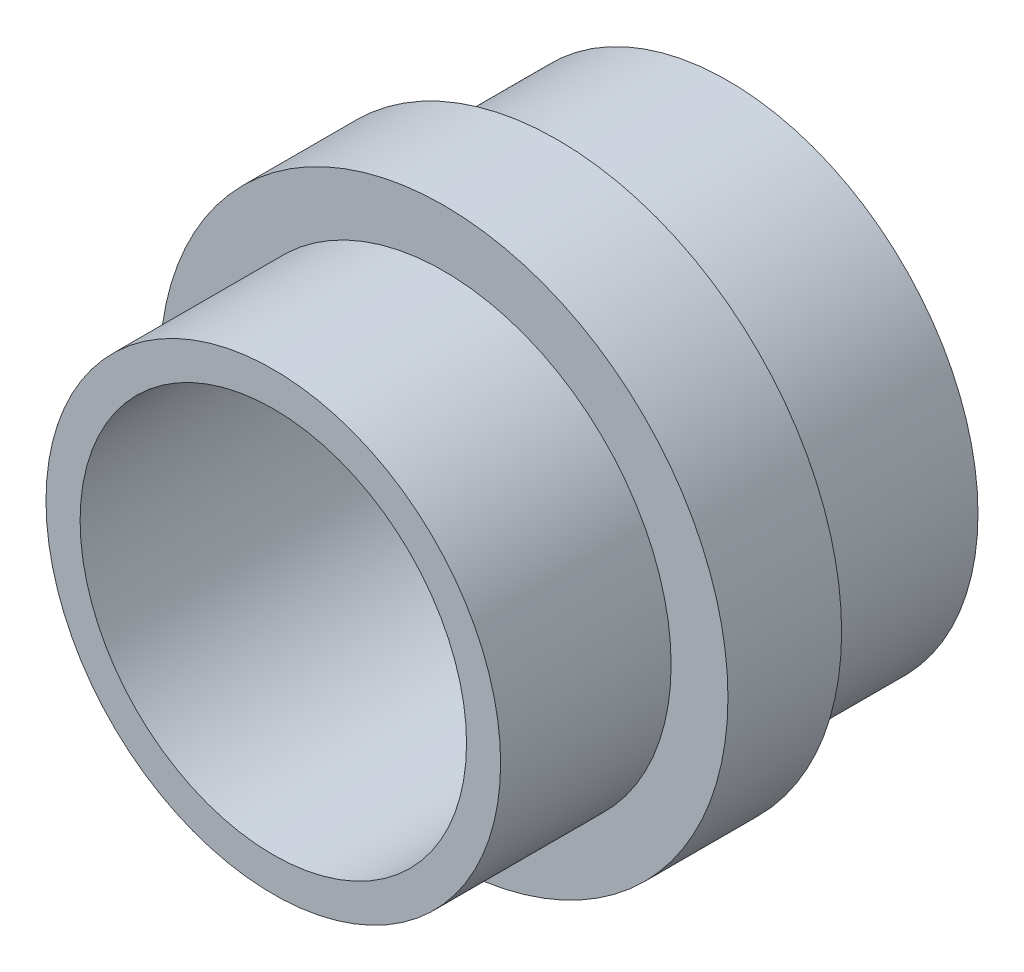
ISO-10303-21;
HEADER;
FILE_DESCRIPTION(('STEP AP214'),'2;1');
FILE_NAME('part.step','',(''),(''),'','','');
FILE_SCHEMA(('AUTOMOTIVE_DESIGN { 1 0 10303 214 1 1 1 1 }'));
ENDSEC;
DATA;
#1=APPLICATION_CONTEXT('core data for automotive mechanical design processes');
#2=APPLICATION_PROTOCOL_DEFINITION('international standard','automotive_design',2000,#1);
#3=PRODUCT_CONTEXT('',#1,'mechanical');
#4=PRODUCT('Part','Part','',(#3));
#5=PRODUCT_RELATED_PRODUCT_CATEGORY('part','',(#4));
#6=PRODUCT_DEFINITION_FORMATION('','',#4);
#7=PRODUCT_DEFINITION_CONTEXT('part definition',#1,'design');
#8=PRODUCT_DEFINITION('design','',#6,#7);
#9=PRODUCT_DEFINITION_SHAPE('','',#8);
#10=(LENGTH_UNIT() NAMED_UNIT(*) SI_UNIT(.MILLI.,.METRE.));
#11=(NAMED_UNIT(*) PLANE_ANGLE_UNIT() SI_UNIT($,.RADIAN.));
#12=(NAMED_UNIT(*) SI_UNIT($,.STERADIAN.) SOLID_ANGLE_UNIT());
#13=UNCERTAINTY_MEASURE_WITH_UNIT(LENGTH_MEASURE(1.E-05),#10,'distance_accuracy_value','');
#14=(GEOMETRIC_REPRESENTATION_CONTEXT(3) GLOBAL_UNCERTAINTY_ASSIGNED_CONTEXT((#13)) GLOBAL_UNIT_ASSIGNED_CONTEXT((#10,
#11,#12)) REPRESENTATION_CONTEXT('',''));
#15=CARTESIAN_POINT('',(0.,0.,0.));
#16=DIRECTION('',(0.,0.,1.));
#17=DIRECTION('',(1.,0.,0.));
#18=AXIS2_PLACEMENT_3D('',#15,#16,#17);
#19=CARTESIAN_POINT('',(0.,20.,15.));
#20=DIRECTION('',(0.,0.,-1.));
#21=DIRECTION('',(-1.,0.,0.));
#22=AXIS2_PLACEMENT_3D('',#19,#20,#21);
#23=PLANE('',#22);
#24=CARTESIAN_POINT('',(0.,0.,14.9999999999999));
#25=DIRECTION('',(0.,0.,1.));
#26=DIRECTION('',(1.,0.,0.));
#27=AXIS2_PLACEMENT_3D('',#24,#25,#26);
#28=CIRCLE('',#27,17.);
#29=CARTESIAN_POINT('',(17.,0.,14.9999999999999));
#30=VERTEX_POINT('',#29);
#31=EDGE_CURVE('E10',#30,#30,#28,.T.);
#32=ORIENTED_EDGE('',*,*,#31,.F.);
#33=EDGE_LOOP('',(#32));
#34=FACE_BOUND('',#33,.T.);
#35=CARTESIAN_POINT('',(0.,0.,14.9999999999999));
#36=DIRECTION('',(0.,0.,1.));
#37=DIRECTION('',(1.,0.,0.));
#38=AXIS2_PLACEMENT_3D('',#35,#36,#37);
#39=CIRCLE('',#38,20.);
#40=CARTESIAN_POINT('',(20.,0.,14.9999999999999));
#41=VERTEX_POINT('',#40);
#42=EDGE_CURVE('E71',#41,#41,#39,.T.);
#43=ORIENTED_EDGE('',*,*,#42,.T.);
#44=EDGE_LOOP('',(#43));
#45=FACE_BOUND('',#44,.T.);
#46=ADVANCED_FACE('F34',(#34,#45),#23,.F.);
#47=CARTESIAN_POINT('',(0.,0.,1506.9929836506));
#48=DIRECTION('',(0.,0.,1.));
#49=DIRECTION('',(1.,0.,0.));
#50=AXIS2_PLACEMENT_3D('',#47,#48,#49);
#51=CYLINDRICAL_SURFACE('',#50,17.);
#52=CARTESIAN_POINT('',(0.,0.,-24.9999999999999));
#53=DIRECTION('',(0.,0.,1.));
#54=DIRECTION('',(1.,0.,0.));
#55=AXIS2_PLACEMENT_3D('',#52,#53,#54);
#56=CIRCLE('',#55,17.);
#57=CARTESIAN_POINT('',(17.,0.,-24.9999999999999));
#58=VERTEX_POINT('',#57);
#59=EDGE_CURVE('E41',#58,#58,#56,.T.);
#60=ORIENTED_EDGE('',*,*,#59,.F.);
#61=EDGE_LOOP('',(#60));
#62=FACE_BOUND('',#61,.T.);
#63=ORIENTED_EDGE('',*,*,#31,.T.);
#64=EDGE_LOOP('',(#63));
#65=FACE_BOUND('',#64,.T.);
#66=ADVANCED_FACE('F110',(#62,#65),#51,.F.);
#67=CARTESIAN_POINT('',(0.,17.,-25.));
#68=DIRECTION('',(0.,0.,1.));
#69=DIRECTION('',(1.,0.,0.));
#70=AXIS2_PLACEMENT_3D('',#67,#68,#69);
#71=PLANE('',#70);
#72=CARTESIAN_POINT('',(0.,0.,-24.9999999999999));
#73=DIRECTION('',(0.,0.,1.));
#74=DIRECTION('',(1.,0.,0.));
#75=AXIS2_PLACEMENT_3D('',#72,#73,#74);
#76=CIRCLE('',#75,22.);
#77=CARTESIAN_POINT('',(22.,0.,-24.9999999999999));
#78=VERTEX_POINT('',#77);
#79=EDGE_CURVE('E47',#78,#78,#76,.T.);
#80=ORIENTED_EDGE('',*,*,#79,.F.);
#81=EDGE_LOOP('',(#80));
#82=FACE_BOUND('',#81,.T.);
#83=ORIENTED_EDGE('',*,*,#59,.T.);
#84=EDGE_LOOP('',(#83));
#85=FACE_BOUND('',#84,.T.);
#86=ADVANCED_FACE('F105',(#82,#85),#71,.F.);
#87=CARTESIAN_POINT('',(0.,0.,1506.9929836506));
#88=DIRECTION('',(0.,0.,1.));
#89=DIRECTION('',(1.,0.,0.));
#90=AXIS2_PLACEMENT_3D('',#87,#88,#89);
#91=CYLINDRICAL_SURFACE('',#90,22.);
#92=CARTESIAN_POINT('',(0.,0.,-10.));
#93=DIRECTION('',(0.,0.,1.));
#94=DIRECTION('',(1.,0.,0.));
#95=AXIS2_PLACEMENT_3D('',#92,#93,#94);
#96=CIRCLE('',#95,22.);
#97=CARTESIAN_POINT('',(22.,0.,-10.));
#98=VERTEX_POINT('',#97);
#99=EDGE_CURVE('E53',#98,#98,#96,.T.);
#100=ORIENTED_EDGE('',*,*,#99,.F.);
#101=EDGE_LOOP('',(#100));
#102=FACE_BOUND('',#101,.T.);
#103=ORIENTED_EDGE('',*,*,#79,.T.);
#104=EDGE_LOOP('',(#103));
#105=FACE_BOUND('',#104,.T.);
#106=ADVANCED_FACE('F99',(#102,#105),#91,.T.);
#107=CARTESIAN_POINT('',(0.,22.,-10.));
#108=DIRECTION('',(0.,0.,1.));
#109=DIRECTION('',(1.,0.,0.));
#110=AXIS2_PLACEMENT_3D('',#107,#108,#109);
#111=PLANE('',#110);
#112=CARTESIAN_POINT('',(0.,0.,-10.));
#113=DIRECTION('',(0.,0.,1.));
#114=DIRECTION('',(1.,0.,0.));
#115=AXIS2_PLACEMENT_3D('',#112,#113,#114);
#116=CIRCLE('',#115,25.);
#117=CARTESIAN_POINT('',(25.,0.,-10.));
#118=VERTEX_POINT('',#117);
#119=EDGE_CURVE('E59',#118,#118,#116,.T.);
#120=ORIENTED_EDGE('',*,*,#119,.F.);
#121=EDGE_LOOP('',(#120));
#122=FACE_BOUND('',#121,.T.);
#123=ORIENTED_EDGE('',*,*,#99,.T.);
#124=EDGE_LOOP('',(#123));
#125=FACE_BOUND('',#124,.T.);
#126=ADVANCED_FACE('F93',(#122,#125),#111,.F.);
#127=CARTESIAN_POINT('',(0.,0.,1506.9929836506));
#128=DIRECTION('',(0.,0.,1.));
#129=DIRECTION('',(1.,0.,0.));
#130=AXIS2_PLACEMENT_3D('',#127,#128,#129);
#131=CYLINDRICAL_SURFACE('',#130,25.);
#132=CARTESIAN_POINT('',(0.,0.,0.));
#133=DIRECTION('',(0.,0.,1.));
#134=DIRECTION('',(1.,0.,0.));
#135=AXIS2_PLACEMENT_3D('',#132,#133,#134);
#136=CIRCLE('',#135,25.);
#137=CARTESIAN_POINT('',(25.,0.,0.));
#138=VERTEX_POINT('',#137);
#139=EDGE_CURVE('E63',#138,#138,#136,.T.);
#140=ORIENTED_EDGE('',*,*,#139,.F.);
#141=EDGE_LOOP('',(#140));
#142=FACE_BOUND('',#141,.T.);
#143=ORIENTED_EDGE('',*,*,#119,.T.);
#144=EDGE_LOOP('',(#143));
#145=FACE_BOUND('',#144,.T.);
#146=ADVANCED_FACE('F87',(#142,#145),#131,.T.);
#147=CARTESIAN_POINT('',(0.,25.,0.));
#148=DIRECTION('',(0.,0.,-1.));
#149=DIRECTION('',(-1.,0.,0.));
#150=AXIS2_PLACEMENT_3D('',#147,#148,#149);
#151=PLANE('',#150);
#152=CARTESIAN_POINT('',(0.,0.,0.));
#153=DIRECTION('',(0.,0.,1.));
#154=DIRECTION('',(1.,0.,0.));
#155=AXIS2_PLACEMENT_3D('',#152,#153,#154);
#156=CIRCLE('',#155,20.);
#157=CARTESIAN_POINT('',(20.,0.,0.));
#158=VERTEX_POINT('',#157);
#159=EDGE_CURVE('E67',#158,#158,#156,.T.);
#160=ORIENTED_EDGE('',*,*,#159,.F.);
#161=EDGE_LOOP('',(#160));
#162=FACE_BOUND('',#161,.T.);
#163=ORIENTED_EDGE('',*,*,#139,.T.);
#164=EDGE_LOOP('',(#163));
#165=FACE_BOUND('',#164,.T.);
#166=ADVANCED_FACE('F81',(#162,#165),#151,.F.);
#167=CARTESIAN_POINT('',(0.,0.,1506.9929836506));
#168=DIRECTION('',(0.,0.,1.));
#169=DIRECTION('',(1.,0.,0.));
#170=AXIS2_PLACEMENT_3D('',#167,#168,#169);
#171=CYLINDRICAL_SURFACE('',#170,20.);
#172=ORIENTED_EDGE('',*,*,#42,.F.);
#173=EDGE_LOOP('',(#172));
#174=FACE_BOUND('',#173,.T.);
#175=ORIENTED_EDGE('',*,*,#159,.T.);
#176=EDGE_LOOP('',(#175));
#177=FACE_BOUND('',#176,.T.);
#178=ADVANCED_FACE('F78',(#174,#177),#171,.T.);
#179=CLOSED_SHELL('',(#46,#66,#86,#106,#126,#146,#166,#178));
#180=MANIFOLD_SOLID_BREP('B2',#179);
#181=ADVANCED_BREP_SHAPE_REPRESENTATION('',(#18,#180),#14);
#182=SHAPE_DEFINITION_REPRESENTATION(#9,#181);
ENDSEC;
END-ISO-10303-21;
